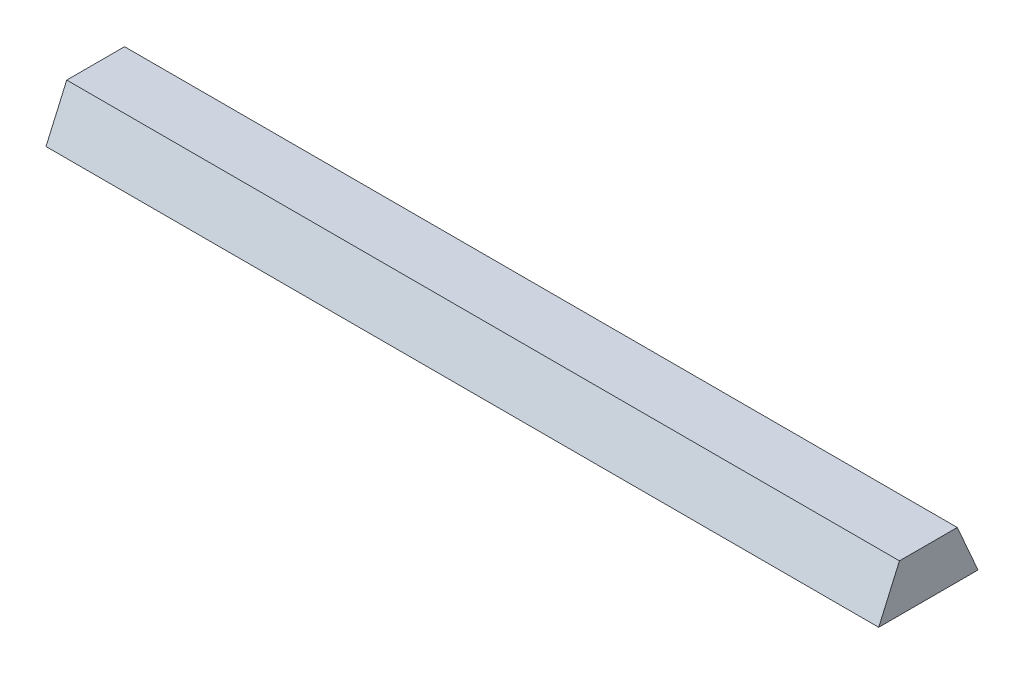
ISO-10303-21;
HEADER;
FILE_DESCRIPTION(('STEP AP214'),'2;1');
FILE_NAME('part.step','',(''),(''),'','','');
FILE_SCHEMA(('AUTOMOTIVE_DESIGN { 1 0 10303 214 1 1 1 1 }'));
ENDSEC;
DATA;
#1=APPLICATION_CONTEXT('core data for automotive mechanical design processes');
#2=APPLICATION_PROTOCOL_DEFINITION('international standard','automotive_design',2000,#1);
#3=PRODUCT_CONTEXT('',#1,'mechanical');
#4=PRODUCT('Part','Part','',(#3));
#5=PRODUCT_RELATED_PRODUCT_CATEGORY('part','',(#4));
#6=PRODUCT_DEFINITION_FORMATION('','',#4);
#7=PRODUCT_DEFINITION_CONTEXT('part definition',#1,'design');
#8=PRODUCT_DEFINITION('design','',#6,#7);
#9=PRODUCT_DEFINITION_SHAPE('','',#8);
#10=(LENGTH_UNIT() NAMED_UNIT(*) SI_UNIT(.MILLI.,.METRE.));
#11=(NAMED_UNIT(*) PLANE_ANGLE_UNIT() SI_UNIT($,.RADIAN.));
#12=(NAMED_UNIT(*) SI_UNIT($,.STERADIAN.) SOLID_ANGLE_UNIT());
#13=UNCERTAINTY_MEASURE_WITH_UNIT(LENGTH_MEASURE(1.E-05),#10,'distance_accuracy_value','');
#14=(GEOMETRIC_REPRESENTATION_CONTEXT(3) GLOBAL_UNCERTAINTY_ASSIGNED_CONTEXT((#13)) GLOBAL_UNIT_ASSIGNED_CONTEXT((#10,
#11,#12)) REPRESENTATION_CONTEXT('',''));
#15=CARTESIAN_POINT('',(0.,0.,0.));
#16=DIRECTION('',(0.,0.,1.));
#17=DIRECTION('',(1.,0.,0.));
#18=AXIS2_PLACEMENT_3D('',#15,#16,#17);
#19=CARTESIAN_POINT('',(360.,20.4063981654799,12.5));
#20=DIRECTION('',(0.,-0.402031197361831,-0.915625969677473));
#21=DIRECTION('',(0.,0.915625969677473,-0.402031197361831));
#22=AXIS2_PLACEMENT_3D('',#19,#20,#21);
#23=PLANE('',#22);
#24=DIRECTION('',(0.,-0.915625969677473,0.402031197361831));
#25=VECTOR('',#24,1.);
#26=CARTESIAN_POINT('',(0.,20.4063981654799,12.5));
#27=LINE('',#26,#25);
#28=CARTESIAN_POINT('',(0.,20.4063981654799,12.5));
#29=VERTEX_POINT('',#28);
#30=CARTESIAN_POINT('',(0.,0.,21.46));
#31=VERTEX_POINT('',#30);
#32=EDGE_CURVE('E96',#29,#31,#27,.T.);
#33=ORIENTED_EDGE('',*,*,#32,.T.);
#34=DIRECTION('',(-1.,0.,0.));
#35=VECTOR('',#34,1.);
#36=CARTESIAN_POINT('',(360.,0.,21.46));
#37=LINE('',#36,#35);
#38=CARTESIAN_POINT('',(360.,0.,21.46));
#39=VERTEX_POINT('',#38);
#40=EDGE_CURVE('E11',#39,#31,#37,.T.);
#41=ORIENTED_EDGE('',*,*,#40,.F.);
#42=DIRECTION('',(0.,-0.915625969677473,0.402031197361831));
#43=VECTOR('',#42,1.);
#44=CARTESIAN_POINT('',(360.,20.4063981654799,12.5));
#45=LINE('',#44,#43);
#46=CARTESIAN_POINT('',(360.,20.4063981654799,12.5));
#47=VERTEX_POINT('',#46);
#48=EDGE_CURVE('E84',#47,#39,#45,.T.);
#49=ORIENTED_EDGE('',*,*,#48,.F.);
#50=DIRECTION('',(-1.,0.,0.));
#51=VECTOR('',#50,1.);
#52=CARTESIAN_POINT('',(360.,20.4063981654799,12.5));
#53=LINE('',#52,#51);
#54=EDGE_CURVE('E92',#47,#29,#53,.T.);
#55=ORIENTED_EDGE('',*,*,#54,.T.);
#56=EDGE_LOOP('',(#33,#41,#49,#55));
#57=FACE_BOUND('',#56,.T.);
#58=ADVANCED_FACE('F33',(#57),#23,.F.);
#59=CARTESIAN_POINT('',(360.,0.,21.46));
#60=DIRECTION('',(0.,1.,0.));
#61=DIRECTION('',(0.,0.,1.));
#62=AXIS2_PLACEMENT_3D('',#59,#60,#61);
#63=PLANE('',#62);
#64=DIRECTION('',(0.,0.,-1.));
#65=VECTOR('',#64,1.);
#66=CARTESIAN_POINT('',(0.,0.,21.46));
#67=LINE('',#66,#65);
#68=CARTESIAN_POINT('',(0.,0.,-21.46));
#69=VERTEX_POINT('',#68);
#70=EDGE_CURVE('E88',#31,#69,#67,.T.);
#71=ORIENTED_EDGE('',*,*,#70,.T.);
#72=DIRECTION('',(-1.,0.,0.));
#73=VECTOR('',#72,1.);
#74=CARTESIAN_POINT('',(360.,0.,-21.46));
#75=LINE('',#74,#73);
#76=CARTESIAN_POINT('',(360.,0.,-21.46));
#77=VERTEX_POINT('',#76);
#78=EDGE_CURVE('E41',#77,#69,#75,.T.);
#79=ORIENTED_EDGE('',*,*,#78,.F.);
#80=DIRECTION('',(0.,0.,-1.));
#81=VECTOR('',#80,1.);
#82=CARTESIAN_POINT('',(360.,0.,21.46));
#83=LINE('',#82,#81);
#84=EDGE_CURVE('E79',#39,#77,#83,.T.);
#85=ORIENTED_EDGE('',*,*,#84,.F.);
#86=ORIENTED_EDGE('',*,*,#40,.T.);
#87=EDGE_LOOP('',(#71,#79,#85,#86));
#88=FACE_BOUND('',#87,.T.);
#89=ADVANCED_FACE('F87',(#88),#63,.F.);
#90=CARTESIAN_POINT('',(360.,0.,-21.46));
#91=DIRECTION('',(0.,-0.402031197361832,0.915625969677473));
#92=DIRECTION('',(0.,-0.915625969677473,-0.402031197361832));
#93=AXIS2_PLACEMENT_3D('',#90,#91,#92);
#94=PLANE('',#93);
#95=DIRECTION('',(0.,0.915625969677473,0.402031197361832));
#96=VECTOR('',#95,1.);
#97=CARTESIAN_POINT('',(0.,0.,-21.46));
#98=LINE('',#97,#96);
#99=CARTESIAN_POINT('',(0.,20.4063981654799,-12.5));
#100=VERTEX_POINT('',#99);
#101=EDGE_CURVE('E66',#69,#100,#98,.T.);
#102=ORIENTED_EDGE('',*,*,#101,.T.);
#103=DIRECTION('',(-1.,0.,0.));
#104=VECTOR('',#103,1.);
#105=CARTESIAN_POINT('',(360.,20.4063981654799,-12.5));
#106=LINE('',#105,#104);
#107=CARTESIAN_POINT('',(360.,20.4063981654799,-12.5));
#108=VERTEX_POINT('',#107);
#109=EDGE_CURVE('E89',#108,#100,#106,.T.);
#110=ORIENTED_EDGE('',*,*,#109,.F.);
#111=DIRECTION('',(0.,0.915625969677473,0.402031197361832));
#112=VECTOR('',#111,1.);
#113=CARTESIAN_POINT('',(360.,0.,-21.46));
#114=LINE('',#113,#112);
#115=EDGE_CURVE('E82',#77,#108,#114,.T.);
#116=ORIENTED_EDGE('',*,*,#115,.F.);
#117=ORIENTED_EDGE('',*,*,#78,.T.);
#118=EDGE_LOOP('',(#102,#110,#116,#117));
#119=FACE_BOUND('',#118,.T.);
#120=ADVANCED_FACE('F90',(#119),#94,.F.);
#121=CARTESIAN_POINT('',(360.,20.4063981654799,12.5));
#122=DIRECTION('',(0.,-1.,0.));
#123=DIRECTION('',(0.,0.,-1.));
#124=AXIS2_PLACEMENT_3D('',#121,#122,#123);
#125=PLANE('',#124);
#126=DIRECTION('',(0.,0.,1.));
#127=VECTOR('',#126,1.);
#128=CARTESIAN_POINT('',(0.,20.4063981654799,12.5));
#129=LINE('',#128,#127);
#130=EDGE_CURVE('E72',#100,#29,#129,.T.);
#131=ORIENTED_EDGE('',*,*,#130,.T.);
#132=ORIENTED_EDGE('',*,*,#54,.F.);
#133=DIRECTION('',(0.,0.,1.));
#134=VECTOR('',#133,1.);
#135=CARTESIAN_POINT('',(360.,20.4063981654799,12.5));
#136=LINE('',#135,#134);
#137=EDGE_CURVE('E49',#108,#47,#136,.T.);
#138=ORIENTED_EDGE('',*,*,#137,.F.);
#139=ORIENTED_EDGE('',*,*,#109,.T.);
#140=EDGE_LOOP('',(#131,#132,#138,#139));
#141=FACE_BOUND('',#140,.T.);
#142=ADVANCED_FACE('F103',(#141),#125,.F.);
#143=CARTESIAN_POINT('',(360.,0.,0.));
#144=DIRECTION('',(1.,0.,0.));
#145=DIRECTION('',(0.,0.,-1.));
#146=AXIS2_PLACEMENT_3D('',#143,#144,#145);
#147=PLANE('',#146);
#148=ORIENTED_EDGE('',*,*,#48,.T.);
#149=ORIENTED_EDGE('',*,*,#84,.T.);
#150=ORIENTED_EDGE('',*,*,#115,.T.);
#151=ORIENTED_EDGE('',*,*,#137,.T.);
#152=EDGE_LOOP('',(#148,#149,#150,#151));
#153=FACE_BOUND('',#152,.T.);
#154=ADVANCED_FACE('F80',(#153),#147,.T.);
#155=CARTESIAN_POINT('',(0.,0.,0.));
#156=DIRECTION('',(1.,0.,0.));
#157=DIRECTION('',(0.,0.,-1.));
#158=AXIS2_PLACEMENT_3D('',#155,#156,#157);
#159=PLANE('',#158);
#160=ORIENTED_EDGE('',*,*,#32,.F.);
#161=ORIENTED_EDGE('',*,*,#130,.F.);
#162=ORIENTED_EDGE('',*,*,#101,.F.);
#163=ORIENTED_EDGE('',*,*,#70,.F.);
#164=EDGE_LOOP('',(#160,#161,#162,#163));
#165=FACE_BOUND('',#164,.T.);
#166=ADVANCED_FACE('F106',(#165),#159,.F.);
#167=CLOSED_SHELL('',(#58,#89,#120,#142,#154,#166));
#168=MANIFOLD_SOLID_BREP('B2',#167);
#169=ADVANCED_BREP_SHAPE_REPRESENTATION('',(#18,#168),#14);
#170=SHAPE_DEFINITION_REPRESENTATION(#9,#169);
ENDSEC;
END-ISO-10303-21;
